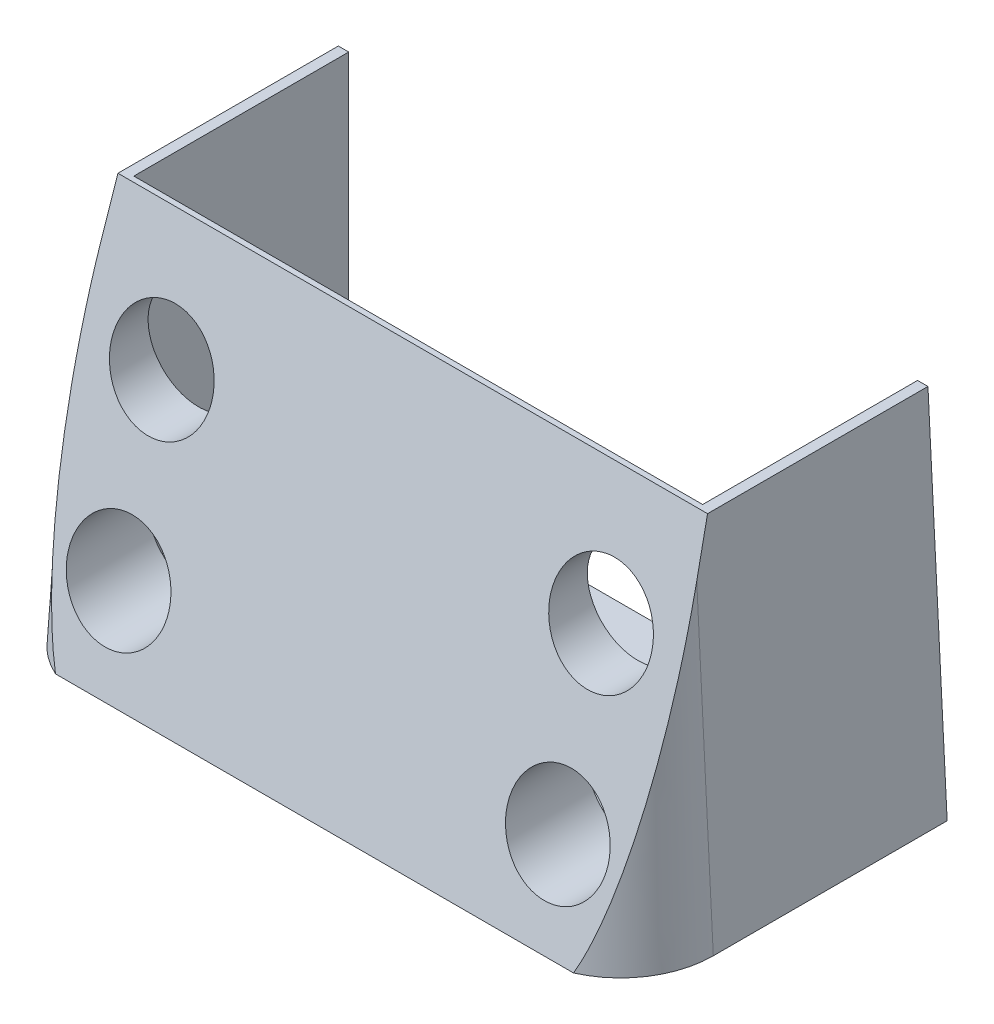
ISO-10303-21;
HEADER;
FILE_DESCRIPTION(('STEP AP214'),'2;1');
FILE_NAME('part.step','',(''),(''),'','','');
FILE_SCHEMA(('AUTOMOTIVE_DESIGN { 1 0 10303 214 1 1 1 1 }'));
ENDSEC;
DATA;
#1=APPLICATION_CONTEXT('core data for automotive mechanical design processes');
#2=APPLICATION_PROTOCOL_DEFINITION('international standard','automotive_design',2000,#1);
#3=PRODUCT_CONTEXT('',#1,'mechanical');
#4=PRODUCT('Part','Part','',(#3));
#5=PRODUCT_RELATED_PRODUCT_CATEGORY('part','',(#4));
#6=PRODUCT_DEFINITION_FORMATION('','',#4);
#7=PRODUCT_DEFINITION_CONTEXT('part definition',#1,'design');
#8=PRODUCT_DEFINITION('design','',#6,#7);
#9=PRODUCT_DEFINITION_SHAPE('','',#8);
#10=(LENGTH_UNIT() NAMED_UNIT(*) SI_UNIT(.MILLI.,.METRE.));
#11=(NAMED_UNIT(*) PLANE_ANGLE_UNIT() SI_UNIT($,.RADIAN.));
#12=(NAMED_UNIT(*) SI_UNIT($,.STERADIAN.) SOLID_ANGLE_UNIT());
#13=UNCERTAINTY_MEASURE_WITH_UNIT(LENGTH_MEASURE(1.E-05),#10,'distance_accuracy_value','');
#14=(GEOMETRIC_REPRESENTATION_CONTEXT(3) GLOBAL_UNCERTAINTY_ASSIGNED_CONTEXT((#13)) GLOBAL_UNIT_ASSIGNED_CONTEXT((#10,
#11,#12)) REPRESENTATION_CONTEXT('',''));
#15=CARTESIAN_POINT('',(0.,0.,0.));
#16=DIRECTION('',(0.,0.,1.));
#17=DIRECTION('',(1.,0.,0.));
#18=AXIS2_PLACEMENT_3D('',#15,#16,#17);
#19=CARTESIAN_POINT('',(30.738531217904,5.52547100644279,39.7908140059585));
#20=DIRECTION('',(0.,0.,-1.));
#21=DIRECTION('',(-1.,0.,0.));
#22=AXIS2_PLACEMENT_3D('',#19,#20,#21);
#23=CYLINDRICAL_SURFACE('',#22,8.);
#24=CARTESIAN_POINT('',(30.738531217904,5.52547100644279,27.618030839345));
#25=DIRECTION('',(0.,-0.258819045102516,-0.96592582628907));
#26=DIRECTION('',(0.,0.96592582628907,-0.258819045102516));
#27=AXIS2_PLACEMENT_3D('',#24,#25,#26);
#28=ELLIPSE('',#27,8.28220944328066,8.);
#29=CARTESIAN_POINT('',(30.738531217904,13.5254710064428,25.4744372998961));
#30=VERTEX_POINT('',#29);
#31=EDGE_CURVE('E242',#30,#30,#28,.F.);
#32=ORIENTED_EDGE('',*,*,#31,.T.);
#33=EDGE_LOOP('',(#32));
#34=FACE_BOUND('',#33,.T.);
#35=CARTESIAN_POINT('',(30.738531217904,5.52547100644279,21.7908140059585));
#36=DIRECTION('',(0.,0.,-1.));
#37=DIRECTION('',(-1.,0.,0.));
#38=AXIS2_PLACEMENT_3D('',#35,#36,#37);
#39=CIRCLE('',#38,8.);
#40=CARTESIAN_POINT('',(22.738531217904,5.52547100644279,21.7908140059585));
#41=VERTEX_POINT('',#40);
#42=EDGE_CURVE('E237',#41,#41,#39,.T.);
#43=ORIENTED_EDGE('',*,*,#42,.T.);
#44=EDGE_LOOP('',(#43));
#45=FACE_BOUND('',#44,.T.);
#46=ADVANCED_FACE('F41',(#34,#45),#23,.F.);
#47=CARTESIAN_POINT('',(-38.761468782096,-19.9745289935572,39.7908140059585));
#48=DIRECTION('',(0.,0.,-1.));
#49=DIRECTION('',(-1.,0.,0.));
#50=AXIS2_PLACEMENT_3D('',#47,#48,#49);
#51=CYLINDRICAL_SURFACE('',#50,8.);
#52=CARTESIAN_POINT('',(-38.761468782096,-19.9745289935572,34.4507352463385));
#53=DIRECTION('',(0.,-0.258819045102516,-0.96592582628907));
#54=DIRECTION('',(0.,0.96592582628907,-0.258819045102516));
#55=AXIS2_PLACEMENT_3D('',#52,#53,#54);
#56=ELLIPSE('',#55,8.28220944328065,8.);
#57=CARTESIAN_POINT('',(-38.761468782096,-11.9745289935572,32.3071417068896));
#58=VERTEX_POINT('',#57);
#59=EDGE_CURVE('E288',#58,#58,#56,.F.);
#60=ORIENTED_EDGE('',*,*,#59,.T.);
#61=EDGE_LOOP('',(#60));
#62=FACE_BOUND('',#61,.T.);
#63=CARTESIAN_POINT('',(-38.761468782096,-19.9745289935572,21.7908140059585));
#64=DIRECTION('',(0.,0.,-1.));
#65=DIRECTION('',(-1.,0.,0.));
#66=AXIS2_PLACEMENT_3D('',#63,#64,#65);
#67=CIRCLE('',#66,8.);
#68=CARTESIAN_POINT('',(-46.761468782096,-19.9745289935572,21.7908140059585));
#69=VERTEX_POINT('',#68);
#70=EDGE_CURVE('E225',#69,#69,#67,.T.);
#71=ORIENTED_EDGE('',*,*,#70,.T.);
#72=EDGE_LOOP('',(#71));
#73=FACE_BOUND('',#72,.T.);
#74=ADVANCED_FACE('F312',(#62,#73),#51,.F.);
#75=CARTESIAN_POINT('',(30.738531217904,-19.9745289935572,39.7908140059585));
#76=DIRECTION('',(0.,0.,-1.));
#77=DIRECTION('',(-1.,0.,0.));
#78=AXIS2_PLACEMENT_3D('',#75,#76,#77);
#79=CYLINDRICAL_SURFACE('',#78,8.);
#80=CARTESIAN_POINT('',(30.738531217904,-19.9745289935572,34.4507352463385));
#81=DIRECTION('',(0.,-0.258819045102516,-0.96592582628907));
#82=DIRECTION('',(0.,0.96592582628907,-0.258819045102516));
#83=AXIS2_PLACEMENT_3D('',#80,#81,#82);
#84=ELLIPSE('',#83,8.28220944328066,8.);
#85=CARTESIAN_POINT('',(30.738531217904,-11.9745289935572,32.3071417068896));
#86=VERTEX_POINT('',#85);
#87=EDGE_CURVE('E290',#86,#86,#84,.F.);
#88=ORIENTED_EDGE('',*,*,#87,.T.);
#89=EDGE_LOOP('',(#88));
#90=FACE_BOUND('',#89,.T.);
#91=CARTESIAN_POINT('',(30.738531217904,-19.9745289935572,21.7908140059585));
#92=DIRECTION('',(0.,0.,-1.));
#93=DIRECTION('',(-1.,0.,0.));
#94=AXIS2_PLACEMENT_3D('',#91,#92,#93);
#95=CIRCLE('',#94,8.);
#96=CARTESIAN_POINT('',(22.738531217904,-19.9745289935572,21.7908140059585));
#97=VERTEX_POINT('',#96);
#98=EDGE_CURVE('E229',#97,#97,#95,.T.);
#99=ORIENTED_EDGE('',*,*,#98,.T.);
#100=EDGE_LOOP('',(#99));
#101=FACE_BOUND('',#100,.T.);
#102=ADVANCED_FACE('F564',(#90,#101),#79,.F.);
#103=CARTESIAN_POINT('',(-38.761468782096,5.52547100644279,39.7908140059585));
#104=DIRECTION('',(0.,0.,-1.));
#105=DIRECTION('',(-1.,0.,0.));
#106=AXIS2_PLACEMENT_3D('',#103,#104,#105);
#107=CYLINDRICAL_SURFACE('',#106,8.);
#108=CARTESIAN_POINT('',(-38.761468782096,5.52547100644279,27.618030839345));
#109=DIRECTION('',(0.,-0.258819045102516,-0.96592582628907));
#110=DIRECTION('',(0.,0.96592582628907,-0.258819045102516));
#111=AXIS2_PLACEMENT_3D('',#108,#109,#110);
#112=ELLIPSE('',#111,8.28220944328065,8.);
#113=CARTESIAN_POINT('',(-38.761468782096,13.5254710064428,25.4744372998961));
#114=VERTEX_POINT('',#113);
#115=EDGE_CURVE('E46',#114,#114,#112,.F.);
#116=ORIENTED_EDGE('',*,*,#115,.T.);
#117=EDGE_LOOP('',(#116));
#118=FACE_BOUND('',#117,.T.);
#119=CARTESIAN_POINT('',(-38.761468782096,5.52547100644279,21.7908140059585));
#120=DIRECTION('',(0.,0.,-1.));
#121=DIRECTION('',(-1.,0.,0.));
#122=AXIS2_PLACEMENT_3D('',#119,#120,#121);
#123=CIRCLE('',#122,8.);
#124=CARTESIAN_POINT('',(-46.761468782096,5.52547100644279,21.7908140059585));
#125=VERTEX_POINT('',#124);
#126=EDGE_CURVE('E234',#125,#125,#123,.T.);
#127=ORIENTED_EDGE('',*,*,#126,.T.);
#128=EDGE_LOOP('',(#127));
#129=FACE_BOUND('',#128,.T.);
#130=ADVANCED_FACE('F297',(#118,#129),#107,.F.);
#131=CARTESIAN_POINT('',(-39.011468782096,-29.9745289935572,-45.2091859940415));
#132=DIRECTION('',(0.,-1.,0.));
#133=DIRECTION('',(0.,0.,-1.));
#134=AXIS2_PLACEMENT_3D('',#131,#132,#133);
#135=PLANE('',#134);
#136=DIRECTION('',(0.,0.,-1.));
#137=VECTOR('',#136,1.);
#138=CARTESIAN_POINT('',(37.6740845422055,-29.9745289935572,30.2020239403742));
#139=LINE('',#138,#137);
#140=CARTESIAN_POINT('',(37.6740845422055,-29.9745289935572,30.2020239403742));
#141=VERTEX_POINT('',#140);
#142=CARTESIAN_POINT('',(37.6740845422055,-29.9745289935572,21.7908140059585));
#143=VERTEX_POINT('',#142);
#144=EDGE_CURVE('E369',#141,#143,#139,.T.);
#145=ORIENTED_EDGE('',*,*,#144,.F.);
#146=DIRECTION('',(1.,0.,0.));
#147=VECTOR('',#146,1.);
#148=CARTESIAN_POINT('',(37.6740845422055,-29.9745289935572,30.2020239403742));
#149=LINE('',#148,#147);
#150=CARTESIAN_POINT('',(29.6740845422055,-29.9745289935572,30.2020239403742));
#151=VERTEX_POINT('',#150);
#152=EDGE_CURVE('E520',#151,#141,#149,.T.);
#153=ORIENTED_EDGE('',*,*,#152,.F.);
#154=DIRECTION('',(0.,0.,1.));
#155=VECTOR('',#154,1.);
#156=CARTESIAN_POINT('',(29.6740845422055,-29.9745289935572,30.2020239403742));
#157=LINE('',#156,#155);
#158=CARTESIAN_POINT('',(29.6740845422055,-29.9745289935572,21.7908140059585));
#159=VERTEX_POINT('',#158);
#160=EDGE_CURVE('E467',#159,#151,#157,.T.);
#161=ORIENTED_EDGE('',*,*,#160,.F.);
#162=DIRECTION('',(-1.,0.,0.));
#163=VECTOR('',#162,1.);
#164=CARTESIAN_POINT('',(-44.011468782096,-29.9745289935572,21.7908140059585));
#165=LINE('',#164,#163);
#166=EDGE_CURVE('E357',#143,#159,#165,.T.);
#167=ORIENTED_EDGE('',*,*,#166,.F.);
#168=EDGE_LOOP('',(#145,#153,#161,#167));
#169=FACE_BOUND('',#168,.T.);
#170=ADVANCED_FACE('F541',(#169),#135,.T.);
#171=CARTESIAN_POINT('',(-39.011468782096,-29.9745289935572,-45.2091859940415));
#172=DIRECTION('',(0.,-1.,0.));
#173=DIRECTION('',(0.,0.,-1.));
#174=AXIS2_PLACEMENT_3D('',#171,#172,#173);
#175=PLANE('',#174);
#176=DIRECTION('',(0.,0.,-1.));
#177=VECTOR('',#176,1.);
#178=CARTESIAN_POINT('',(-37.6970221063976,-29.9745289935572,30.2020239403742));
#179=LINE('',#178,#177);
#180=CARTESIAN_POINT('',(-37.6970221063976,-29.9745289935572,30.2020239403742));
#181=VERTEX_POINT('',#180);
#182=CARTESIAN_POINT('',(-37.6970221063976,-29.9745289935572,21.7908140059585));
#183=VERTEX_POINT('',#182);
#184=EDGE_CURVE('E502',#181,#183,#179,.T.);
#185=ORIENTED_EDGE('',*,*,#184,.F.);
#186=DIRECTION('',(1.,0.,0.));
#187=VECTOR('',#186,1.);
#188=CARTESIAN_POINT('',(-45.6970221063976,-29.9745289935572,30.2020239403742));
#189=LINE('',#188,#187);
#190=CARTESIAN_POINT('',(-45.6970221063976,-29.9745289935572,30.2020239403742));
#191=VERTEX_POINT('',#190);
#192=EDGE_CURVE('E505',#191,#181,#189,.T.);
#193=ORIENTED_EDGE('',*,*,#192,.F.);
#194=DIRECTION('',(0.,0.,1.));
#195=VECTOR('',#194,1.);
#196=CARTESIAN_POINT('',(-45.6970221063976,-29.9745289935572,30.2020239403742));
#197=LINE('',#196,#195);
#198=CARTESIAN_POINT('',(-45.6970221063976,-29.9745289935572,21.7908140059585));
#199=VERTEX_POINT('',#198);
#200=EDGE_CURVE('E366',#199,#191,#197,.T.);
#201=ORIENTED_EDGE('',*,*,#200,.F.);
#202=DIRECTION('',(-1.,0.,0.));
#203=VECTOR('',#202,1.);
#204=CARTESIAN_POINT('',(-44.011468782096,-29.9745289935572,21.7908140059585));
#205=LINE('',#204,#203);
#206=EDGE_CURVE('E356',#183,#199,#205,.T.);
#207=ORIENTED_EDGE('',*,*,#206,.F.);
#208=EDGE_LOOP('',(#185,#193,#201,#207));
#209=FACE_BOUND('',#208,.T.);
#210=ADVANCED_FACE('F594',(#209),#175,.T.);
#211=CARTESIAN_POINT('',(-39.011468782096,-29.9745289935572,-45.2091859940415));
#212=DIRECTION('',(0.,-1.,0.));
#213=DIRECTION('',(0.,0.,-1.));
#214=AXIS2_PLACEMENT_3D('',#211,#212,#213);
#215=PLANE('',#214);
#216=DIRECTION('',(1.,0.,0.));
#217=VECTOR('',#216,1.);
#218=CARTESIAN_POINT('',(-49.011468782096,-29.9745289935572,14.7908140059585));
#219=LINE('',#218,#217);
#220=CARTESIAN_POINT('',(-37.6970221063976,-29.9745289935572,14.7908140059585));
#221=VERTEX_POINT('',#220);
#222=CARTESIAN_POINT('',(29.6740845422055,-29.9745289935572,14.7908140059585));
#223=VERTEX_POINT('',#222);
#224=EDGE_CURVE('E393',#221,#223,#219,.T.);
#225=ORIENTED_EDGE('',*,*,#224,.F.);
#226=EDGE_CURVE('E353',#183,#221,#179,.T.);
#227=ORIENTED_EDGE('',*,*,#226,.F.);
#228=DIRECTION('',(1.,0.,0.));
#229=VECTOR('',#228,1.);
#230=CARTESIAN_POINT('',(-44.011468782096,-29.9745289935572,21.7908140059585));
#231=LINE('',#230,#229);
#232=EDGE_CURVE('E268',#183,#159,#231,.T.);
#233=ORIENTED_EDGE('',*,*,#232,.T.);
#234=EDGE_CURVE('E350',#223,#159,#157,.T.);
#235=ORIENTED_EDGE('',*,*,#234,.F.);
#236=EDGE_LOOP('',(#225,#227,#233,#235));
#237=FACE_BOUND('',#236,.T.);
#238=ADVANCED_FACE('F348',(#237),#215,.F.);
#239=CARTESIAN_POINT('',(-49.011468782096,-29.9745289935572,21.7908140059585));
#240=VERTEX_POINT('',#239);
#241=EDGE_CURVE('E265',#240,#199,#231,.T.);
#242=ORIENTED_EDGE('',*,*,#241,.T.);
#243=CARTESIAN_POINT('',(-45.6970221063976,-29.9745289935572,14.7908140059585));
#244=VERTEX_POINT('',#243);
#245=EDGE_CURVE('E361',#244,#199,#197,.T.);
#246=ORIENTED_EDGE('',*,*,#245,.F.);
#247=CARTESIAN_POINT('',(-49.011468782096,-29.9745289935572,14.7908140059585));
#248=VERTEX_POINT('',#247);
#249=EDGE_CURVE('E389',#248,#244,#219,.T.);
#250=ORIENTED_EDGE('',*,*,#249,.F.);
#251=DIRECTION('',(0.,0.,1.));
#252=VECTOR('',#251,1.);
#253=CARTESIAN_POINT('',(-49.011468782096,-29.9745289935572,26.7908140059585));
#254=LINE('',#253,#252);
#255=EDGE_CURVE('E257',#248,#240,#254,.T.);
#256=ORIENTED_EDGE('',*,*,#255,.T.);
#257=EDGE_LOOP('',(#242,#246,#250,#256));
#258=FACE_BOUND('',#257,.T.);
#259=ADVANCED_FACE('F449',(#258),#215,.F.);
#260=CARTESIAN_POINT('',(37.6740845422055,-29.9745289935572,14.7908140059585));
#261=VERTEX_POINT('',#260);
#262=CARTESIAN_POINT('',(40.988531217904,-29.9745289935572,14.7908140059585));
#263=VERTEX_POINT('',#262);
#264=EDGE_CURVE('E339',#261,#263,#219,.T.);
#265=ORIENTED_EDGE('',*,*,#264,.F.);
#266=EDGE_CURVE('E341',#143,#261,#139,.T.);
#267=ORIENTED_EDGE('',*,*,#266,.F.);
#268=CARTESIAN_POINT('',(40.988531217904,-29.9745289935572,21.7908140059585));
#269=VERTEX_POINT('',#268);
#270=EDGE_CURVE('E264',#143,#269,#231,.T.);
#271=ORIENTED_EDGE('',*,*,#270,.T.);
#272=DIRECTION('',(0.,0.,-1.));
#273=VECTOR('',#272,1.);
#274=CARTESIAN_POINT('',(40.988531217904,-29.9745289935572,26.7908140059585));
#275=LINE('',#274,#273);
#276=EDGE_CURVE('E261',#269,#263,#275,.T.);
#277=ORIENTED_EDGE('',*,*,#276,.T.);
#278=EDGE_LOOP('',(#265,#267,#271,#277));
#279=FACE_BOUND('',#278,.T.);
#280=ADVANCED_FACE('F337',(#279),#215,.F.);
#281=CARTESIAN_POINT('',(-53.6970221063976,-15.9745289935572,-70.2091859940415));
#282=DIRECTION('',(0.,-1.,0.));
#283=DIRECTION('',(0.,0.,-1.));
#284=AXIS2_PLACEMENT_3D('',#281,#282,#283);
#285=PLANE('',#284);
#286=DIRECTION('',(-1.,0.,0.));
#287=VECTOR('',#286,1.);
#288=CARTESIAN_POINT('',(-49.011468782096,-15.9745289935572,14.7908140059585));
#289=LINE('',#288,#287);
#290=CARTESIAN_POINT('',(40.988531217904,-15.9745289935572,14.7908140059585));
#291=VERTEX_POINT('',#290);
#292=CARTESIAN_POINT('',(-49.011468782096,-15.9745289935572,14.7908140059585));
#293=VERTEX_POINT('',#292);
#294=EDGE_CURVE('E395',#291,#293,#289,.T.);
#295=ORIENTED_EDGE('',*,*,#294,.F.);
#296=DIRECTION('',(0.,0.,1.));
#297=VECTOR('',#296,1.);
#298=CARTESIAN_POINT('',(40.988531217904,-15.9745289935572,14.7908140059585));
#299=LINE('',#298,#297);
#300=CARTESIAN_POINT('',(40.988531217904,-15.9745289935572,11.7908140059585));
#301=VERTEX_POINT('',#300);
#302=EDGE_CURVE('E376',#301,#291,#299,.T.);
#303=ORIENTED_EDGE('',*,*,#302,.F.);
#304=DIRECTION('',(1.,0.,0.));
#305=VECTOR('',#304,1.);
#306=CARTESIAN_POINT('',(-49.011468782096,-15.9745289935572,11.7908140059585));
#307=LINE('',#306,#305);
#308=CARTESIAN_POINT('',(-49.011468782096,-15.9745289935572,11.7908140059585));
#309=VERTEX_POINT('',#308);
#310=EDGE_CURVE('E372',#309,#301,#307,.T.);
#311=ORIENTED_EDGE('',*,*,#310,.F.);
#312=DIRECTION('',(0.,0.,-1.));
#313=VECTOR('',#312,1.);
#314=CARTESIAN_POINT('',(-49.011468782096,-15.9745289935572,14.7908140059585));
#315=LINE('',#314,#313);
#316=EDGE_CURVE('E363',#293,#309,#315,.T.);
#317=ORIENTED_EDGE('',*,*,#316,.F.);
#318=EDGE_LOOP('',(#295,#303,#311,#317));
#319=FACE_BOUND('',#318,.T.);
#320=ADVANCED_FACE('F480',(#319),#285,.F.);
#321=CARTESIAN_POINT('',(-49.011468782096,75.0323388791479,11.7908140059585));
#322=DIRECTION('',(0.,0.,1.));
#323=DIRECTION('',(1.,0.,0.));
#324=AXIS2_PLACEMENT_3D('',#321,#322,#323);
#325=PLANE('',#324);
#326=DIRECTION('',(0.,-1.,0.));
#327=VECTOR('',#326,1.);
#328=CARTESIAN_POINT('',(-49.011468782096,75.0323388791479,11.7908140059585));
#329=LINE('',#328,#327);
#330=CARTESIAN_POINT('',(-49.011468782096,-29.9745289935572,11.7908140059585));
#331=VERTEX_POINT('',#330);
#332=EDGE_CURVE('E383',#309,#331,#329,.T.);
#333=ORIENTED_EDGE('',*,*,#332,.F.);
#334=ORIENTED_EDGE('',*,*,#310,.T.);
#335=DIRECTION('',(0.,-1.,0.));
#336=VECTOR('',#335,1.);
#337=CARTESIAN_POINT('',(40.988531217904,75.0323388791479,11.7908140059585));
#338=LINE('',#337,#336);
#339=CARTESIAN_POINT('',(40.988531217904,-29.9745289935572,11.7908140059585));
#340=VERTEX_POINT('',#339);
#341=EDGE_CURVE('E380',#301,#340,#338,.T.);
#342=ORIENTED_EDGE('',*,*,#341,.T.);
#343=DIRECTION('',(-1.,0.,0.));
#344=VECTOR('',#343,1.);
#345=CARTESIAN_POINT('',(-49.011468782096,-29.9745289935572,11.7908140059585));
#346=LINE('',#345,#344);
#347=EDGE_CURVE('E386',#340,#331,#346,.T.);
#348=ORIENTED_EDGE('',*,*,#347,.T.);
#349=EDGE_LOOP('',(#333,#334,#342,#348));
#350=FACE_BOUND('',#349,.T.);
#351=ADVANCED_FACE('F319',(#350),#325,.F.);
#352=CARTESIAN_POINT('',(-44.011468782096,-14.9745289935572,21.7908140059585));
#353=DIRECTION('',(0.,0.,-1.));
#354=DIRECTION('',(-1.,0.,0.));
#355=AXIS2_PLACEMENT_3D('',#352,#353,#354);
#356=PLANE('',#355);
#357=ORIENTED_EDGE('',*,*,#126,.F.);
#358=EDGE_LOOP('',(#357));
#359=FACE_BOUND('',#358,.T.);
#360=ORIENTED_EDGE('',*,*,#98,.F.);
#361=EDGE_LOOP('',(#360));
#362=FACE_BOUND('',#361,.T.);
#363=ORIENTED_EDGE('',*,*,#70,.F.);
#364=EDGE_LOOP('',(#363));
#365=FACE_BOUND('',#364,.T.);
#366=ORIENTED_EDGE('',*,*,#42,.F.);
#367=EDGE_LOOP('',(#366));
#368=FACE_BOUND('',#367,.T.);
#369=DIRECTION('',(0.,-1.,0.));
#370=VECTOR('',#369,1.);
#371=CARTESIAN_POINT('',(40.988531217904,24.0254710064428,21.7908140059585));
#372=LINE('',#371,#370);
#373=CARTESIAN_POINT('',(40.988531217904,24.0254710064428,21.7908140059585));
#374=VERTEX_POINT('',#373);
#375=EDGE_CURVE('E254',#374,#269,#372,.T.);
#376=ORIENTED_EDGE('',*,*,#375,.T.);
#377=ORIENTED_EDGE('',*,*,#270,.F.);
#378=ORIENTED_EDGE('',*,*,#166,.T.);
#379=ORIENTED_EDGE('',*,*,#232,.F.);
#380=ORIENTED_EDGE('',*,*,#206,.T.);
#381=ORIENTED_EDGE('',*,*,#241,.F.);
#382=DIRECTION('',(0.,-1.,0.));
#383=VECTOR('',#382,1.);
#384=CARTESIAN_POINT('',(-49.011468782096,24.0254710064428,21.7908140059585));
#385=LINE('',#384,#383);
#386=CARTESIAN_POINT('',(-49.011468782096,24.0254710064428,21.7908140059585));
#387=VERTEX_POINT('',#386);
#388=EDGE_CURVE('E251',#387,#240,#385,.T.);
#389=ORIENTED_EDGE('',*,*,#388,.F.);
#390=DIRECTION('',(1.,0.,0.));
#391=VECTOR('',#390,1.);
#392=CARTESIAN_POINT('',(40.988531217904,24.0254710064428,21.7908140059585));
#393=LINE('',#392,#391);
#394=EDGE_CURVE('E243',#387,#374,#393,.T.);
#395=ORIENTED_EDGE('',*,*,#394,.T.);
#396=EDGE_LOOP('',(#376,#377,#378,#379,#380,#381,#389,#395));
#397=FACE_BOUND('',#396,.T.);
#398=ADVANCED_FACE('F316',(#359,#362,#365,#368,#397),#356,.T.);
#399=CARTESIAN_POINT('',(-39.011468782096,24.0254710064428,24.7908140059585));
#400=DIRECTION('',(0.,-1.,0.));
#401=DIRECTION('',(0.,0.,-1.));
#402=AXIS2_PLACEMENT_3D('',#399,#400,#401);
#403=CONICAL_SURFACE('',#402,11.6459021258853,0.0523598775598275);
#404=CARTESIAN_POINT('',(-39.011468782096,-33.9745289935572,24.7908140059585));
#405=DIRECTION('',(0.,1.,0.));
#406=DIRECTION('',(0.,0.,1.));
#407=AXIS2_PLACEMENT_3D('',#404,#405,#406);
#408=CIRCLE('',#407,14.6855533243015);
#409=CARTESIAN_POINT('',(-44.995190411311,-33.9745289935572,38.2020239403742));
#410=VERTEX_POINT('',#409);
#411=CARTESIAN_POINT('',(-53.6970221063976,-33.9745289935572,24.7908140059585));
#412=VERTEX_POINT('',#411);
#413=EDGE_CURVE('E224',#410,#412,#408,.F.);
#414=ORIENTED_EDGE('',*,*,#413,.F.);
#415=CARTESIAN_POINT('',(-39.011468782096,6.92159966935667,27.2439392915873));
#416=DIRECTION('',(0.,-0.258819045102516,-0.96592582628907));
#417=DIRECTION('',(0.,-0.965925826289069,0.258819045102516));
#418=AXIS2_PLACEMENT_3D('',#415,#416,#417);
#419=ELLIPSE('',#418,48.4596411165837,12.3000371853413);
#420=CARTESIAN_POINT('',(-51.0739437392477,16.0767878726555,24.7908140059585));
#421=VERTEX_POINT('',#420);
#422=EDGE_CURVE('E51',#410,#421,#419,.T.);
#423=ORIENTED_EDGE('',*,*,#422,.T.);
#424=DIRECTION('',(-0.0523359562429415,-0.998629534754574,0.));
#425=VECTOR('',#424,1.);
#426=CARTESIAN_POINT('',(-50.6573709079813,24.0254710064428,24.7908140059585));
#427=LINE('',#426,#425);
#428=EDGE_CURVE('E246',#421,#412,#427,.T.);
#429=ORIENTED_EDGE('',*,*,#428,.T.);
#430=EDGE_LOOP('',(#414,#423,#429));
#431=FACE_BOUND('',#430,.T.);
#432=ADVANCED_FACE('F303',(#431),#403,.T.);
#433=CARTESIAN_POINT('',(-39.011468782096,24.0254710064428,22.6609707793693));
#434=DIRECTION('',(0.,-0.258819045102516,-0.96592582628907));
#435=DIRECTION('',(1.,0.,0.));
#436=AXIS2_PLACEMENT_3D('',#433,#434,#435);
#437=PLANE('',#436);
#438=DIRECTION('',(1.,0.,0.));
#439=VECTOR('',#438,1.);
#440=CARTESIAN_POINT('',(-39.011468782096,-33.9745289935572,38.2020239403742));
#441=LINE('',#440,#439);
#442=CARTESIAN_POINT('',(36.9722528471189,-33.9745289935572,38.2020239403742));
#443=VERTEX_POINT('',#442);
#444=EDGE_CURVE('E392',#443,#410,#441,.F.);
#445=ORIENTED_EDGE('',*,*,#444,.F.);
#446=CARTESIAN_POINT('',(30.988531217904,6.92159966935676,27.2439392915873));
#447=DIRECTION('',(0.,-0.258819045102516,-0.96592582628907));
#448=DIRECTION('',(0.,-0.965925826289069,0.258819045102516));
#449=AXIS2_PLACEMENT_3D('',#446,#447,#448);
#450=ELLIPSE('',#449,48.4596411165838,12.3000371853413);
#451=CARTESIAN_POINT('',(43.0510061750556,16.0767878726556,24.7908140059585));
#452=VERTEX_POINT('',#451);
#453=EDGE_CURVE('E282',#452,#443,#450,.T.);
#454=ORIENTED_EDGE('',*,*,#453,.F.);
#455=DIRECTION('',(-0.0505572901604935,0.964690564113556,-0.258488057600147));
#456=VECTOR('',#455,1.);
#457=CARTESIAN_POINT('',(41.7474752045323,40.9496404978998,18.1261532315661));
#458=LINE('',#457,#456);
#459=CARTESIAN_POINT('',(42.6344333437893,24.0254710064428,22.6609707793694));
#460=VERTEX_POINT('',#459);
#461=EDGE_CURVE('E279',#460,#452,#458,.F.);
#462=ORIENTED_EDGE('',*,*,#461,.F.);
#463=DIRECTION('',(1.,0.,0.));
#464=VECTOR('',#463,1.);
#465=CARTESIAN_POINT('',(-39.011468782096,24.0254710064428,22.6609707793693));
#466=LINE('',#465,#464);
#467=CARTESIAN_POINT('',(-50.6573709079813,24.0254710064428,22.6609707793693));
#468=VERTEX_POINT('',#467);
#469=EDGE_CURVE('E273',#468,#460,#466,.T.);
#470=ORIENTED_EDGE('',*,*,#469,.F.);
#471=DIRECTION('',(-0.0505572901604934,-0.964690564113556,0.258488057600147));
#472=VECTOR('',#471,1.);
#473=CARTESIAN_POINT('',(-49.7704127687243,40.9496404978998,18.1261532315661));
#474=LINE('',#473,#472);
#475=EDGE_CURVE('E11',#421,#468,#474,.F.);
#476=ORIENTED_EDGE('',*,*,#475,.F.);
#477=ORIENTED_EDGE('',*,*,#422,.F.);
#478=EDGE_LOOP('',(#445,#454,#462,#470,#476,#477));
#479=FACE_BOUND('',#478,.T.);
#480=ORIENTED_EDGE('',*,*,#115,.F.);
#481=EDGE_LOOP('',(#480));
#482=FACE_BOUND('',#481,.T.);
#483=ORIENTED_EDGE('',*,*,#87,.F.);
#484=EDGE_LOOP('',(#483));
#485=FACE_BOUND('',#484,.T.);
#486=ORIENTED_EDGE('',*,*,#59,.F.);
#487=EDGE_LOOP('',(#486));
#488=FACE_BOUND('',#487,.T.);
#489=ORIENTED_EDGE('',*,*,#31,.F.);
#490=EDGE_LOOP('',(#489));
#491=FACE_BOUND('',#490,.T.);
#492=ADVANCED_FACE('F44',(#479,#482,#485,#488,#491),#437,.F.);
#493=CARTESIAN_POINT('',(30.988531217904,24.0254710064428,24.7908140059585));
#494=DIRECTION('',(0.,-1.,0.));
#495=DIRECTION('',(0.,0.,-1.));
#496=AXIS2_PLACEMENT_3D('',#493,#494,#495);
#497=CONICAL_SURFACE('',#496,11.6459021258853,0.0523598775598275);
#498=CARTESIAN_POINT('',(30.988531217904,-33.9745289935572,24.7908140059585));
#499=DIRECTION('',(0.,1.,0.));
#500=DIRECTION('',(0.,0.,1.));
#501=AXIS2_PLACEMENT_3D('',#498,#499,#500);
#502=CIRCLE('',#501,14.6855533243016);
#503=CARTESIAN_POINT('',(45.6740845422055,-33.9745289935572,24.7908140059585));
#504=VERTEX_POINT('',#503);
#505=EDGE_CURVE('E400',#504,#443,#502,.F.);
#506=ORIENTED_EDGE('',*,*,#505,.F.);
#507=DIRECTION('',(-0.0523359562429415,0.998629534754574,0.));
#508=VECTOR('',#507,1.);
#509=CARTESIAN_POINT('',(45.988531217904,-39.9745289935614,24.7908140059585));
#510=LINE('',#509,#508);
#511=EDGE_CURVE('E274',#504,#452,#510,.T.);
#512=ORIENTED_EDGE('',*,*,#511,.T.);
#513=ORIENTED_EDGE('',*,*,#453,.T.);
#514=EDGE_LOOP('',(#506,#512,#513));
#515=FACE_BOUND('',#514,.T.);
#516=ADVANCED_FACE('F302',(#515),#497,.T.);
#517=CARTESIAN_POINT('',(37.6740845422055,-12.6106183844049,30.2020239403742));
#518=DIRECTION('',(1.,0.,0.));
#519=DIRECTION('',(0.,1.,0.));
#520=AXIS2_PLACEMENT_3D('',#517,#518,#519);
#521=PLANE('',#520);
#522=ORIENTED_EDGE('',*,*,#144,.T.);
#523=ORIENTED_EDGE('',*,*,#266,.T.);
#524=DIRECTION('',(0.,-1.,0.));
#525=VECTOR('',#524,1.);
#526=CARTESIAN_POINT('',(37.6740845422055,-12.6106183844049,14.7908140059585));
#527=LINE('',#526,#525);
#528=CARTESIAN_POINT('',(37.6740845422055,-33.9745289935572,14.7908140059585));
#529=VERTEX_POINT('',#528);
#530=EDGE_CURVE('E485',#261,#529,#527,.T.);
#531=ORIENTED_EDGE('',*,*,#530,.T.);
#532=DIRECTION('',(0.,0.,1.));
#533=VECTOR('',#532,1.);
#534=CARTESIAN_POINT('',(37.6740845422055,-33.9745289935572,30.2020239403742));
#535=LINE('',#534,#533);
#536=CARTESIAN_POINT('',(37.6740845422055,-33.9745289935572,30.2020239403742));
#537=VERTEX_POINT('',#536);
#538=EDGE_CURVE('E524',#529,#537,#535,.T.);
#539=ORIENTED_EDGE('',*,*,#538,.T.);
#540=DIRECTION('',(0.,-1.,0.));
#541=VECTOR('',#540,1.);
#542=CARTESIAN_POINT('',(37.6740845422055,-12.6106183844049,30.2020239403742));
#543=LINE('',#542,#541);
#544=EDGE_CURVE('E527',#141,#537,#543,.T.);
#545=ORIENTED_EDGE('',*,*,#544,.F.);
#546=EDGE_LOOP('',(#522,#523,#531,#539,#545));
#547=FACE_BOUND('',#546,.T.);
#548=ADVANCED_FACE('F540',(#547),#521,.F.);
#549=CARTESIAN_POINT('',(37.6740845422055,-12.6106183844049,30.2020239403742));
#550=DIRECTION('',(0.,0.,1.));
#551=DIRECTION('',(1.,0.,0.));
#552=AXIS2_PLACEMENT_3D('',#549,#550,#551);
#553=PLANE('',#552);
#554=ORIENTED_EDGE('',*,*,#152,.T.);
#555=ORIENTED_EDGE('',*,*,#544,.T.);
#556=DIRECTION('',(-1.,0.,0.));
#557=VECTOR('',#556,1.);
#558=CARTESIAN_POINT('',(37.6740845422055,-33.9745289935572,30.2020239403742));
#559=LINE('',#558,#557);
#560=CARTESIAN_POINT('',(29.6740845422055,-33.9745289935572,30.2020239403742));
#561=VERTEX_POINT('',#560);
#562=EDGE_CURVE('E510',#537,#561,#559,.T.);
#563=ORIENTED_EDGE('',*,*,#562,.T.);
#564=DIRECTION('',(0.,-1.,0.));
#565=VECTOR('',#564,1.);
#566=CARTESIAN_POINT('',(29.6740845422055,-12.6106183844049,30.2020239403742));
#567=LINE('',#566,#565);
#568=EDGE_CURVE('E521',#151,#561,#567,.T.);
#569=ORIENTED_EDGE('',*,*,#568,.F.);
#570=EDGE_LOOP('',(#554,#555,#563,#569));
#571=FACE_BOUND('',#570,.T.);
#572=ADVANCED_FACE('F542',(#571),#553,.F.);
#573=CARTESIAN_POINT('',(29.6740845422055,-12.6106183844049,30.2020239403742));
#574=DIRECTION('',(-1.,0.,0.));
#575=DIRECTION('',(0.,0.,1.));
#576=AXIS2_PLACEMENT_3D('',#573,#574,#575);
#577=PLANE('',#576);
#578=ORIENTED_EDGE('',*,*,#234,.T.);
#579=ORIENTED_EDGE('',*,*,#160,.T.);
#580=ORIENTED_EDGE('',*,*,#568,.T.);
#581=DIRECTION('',(0.,0.,-1.));
#582=VECTOR('',#581,1.);
#583=CARTESIAN_POINT('',(29.6740845422055,-33.9745289935572,30.2020239403742));
#584=LINE('',#583,#582);
#585=CARTESIAN_POINT('',(29.6740845422055,-33.9745289935572,14.7908140059585));
#586=VERTEX_POINT('',#585);
#587=EDGE_CURVE('E533',#561,#586,#584,.T.);
#588=ORIENTED_EDGE('',*,*,#587,.T.);
#589=DIRECTION('',(0.,-1.,0.));
#590=VECTOR('',#589,1.);
#591=CARTESIAN_POINT('',(29.6740845422055,-12.6106183844049,14.7908140059585));
#592=LINE('',#591,#590);
#593=EDGE_CURVE('E486',#223,#586,#592,.T.);
#594=ORIENTED_EDGE('',*,*,#593,.F.);
#595=EDGE_LOOP('',(#578,#579,#580,#588,#594));
#596=FACE_BOUND('',#595,.T.);
#597=ADVANCED_FACE('F546',(#596),#577,.F.);
#598=CARTESIAN_POINT('',(-37.6970221063976,-12.6106183844049,30.2020239403742));
#599=DIRECTION('',(1.,0.,0.));
#600=DIRECTION('',(0.,0.,-1.));
#601=AXIS2_PLACEMENT_3D('',#598,#599,#600);
#602=PLANE('',#601);
#603=ORIENTED_EDGE('',*,*,#184,.T.);
#604=ORIENTED_EDGE('',*,*,#226,.T.);
#605=DIRECTION('',(0.,-1.,0.));
#606=VECTOR('',#605,1.);
#607=CARTESIAN_POINT('',(-37.6970221063976,-12.6106183844049,14.7908140059585));
#608=LINE('',#607,#606);
#609=CARTESIAN_POINT('',(-37.6970221063976,-33.9745289935572,14.7908140059585));
#610=VERTEX_POINT('',#609);
#611=EDGE_CURVE('E489',#221,#610,#608,.T.);
#612=ORIENTED_EDGE('',*,*,#611,.T.);
#613=DIRECTION('',(0.,0.,1.));
#614=VECTOR('',#613,1.);
#615=CARTESIAN_POINT('',(-37.6970221063976,-33.9745289935572,30.2020239403742));
#616=LINE('',#615,#614);
#617=CARTESIAN_POINT('',(-37.6970221063976,-33.9745289935572,30.2020239403742));
#618=VERTEX_POINT('',#617);
#619=EDGE_CURVE('E512',#610,#618,#616,.T.);
#620=ORIENTED_EDGE('',*,*,#619,.T.);
#621=DIRECTION('',(0.,-1.,0.));
#622=VECTOR('',#621,1.);
#623=CARTESIAN_POINT('',(-37.6970221063976,-12.6106183844049,30.2020239403742));
#624=LINE('',#623,#622);
#625=EDGE_CURVE('E495',#181,#618,#624,.T.);
#626=ORIENTED_EDGE('',*,*,#625,.F.);
#627=EDGE_LOOP('',(#603,#604,#612,#620,#626));
#628=FACE_BOUND('',#627,.T.);
#629=ADVANCED_FACE('F499',(#628),#602,.F.);
#630=CARTESIAN_POINT('',(-45.6970221063976,-12.6106183844049,30.2020239403742));
#631=DIRECTION('',(0.,0.,1.));
#632=DIRECTION('',(1.,0.,0.));
#633=AXIS2_PLACEMENT_3D('',#630,#631,#632);
#634=PLANE('',#633);
#635=ORIENTED_EDGE('',*,*,#192,.T.);
#636=ORIENTED_EDGE('',*,*,#625,.T.);
#637=DIRECTION('',(-1.,0.,0.));
#638=VECTOR('',#637,1.);
#639=CARTESIAN_POINT('',(-45.6970221063976,-33.9745289935572,30.2020239403742));
#640=LINE('',#639,#638);
#641=CARTESIAN_POINT('',(-45.6970221063976,-33.9745289935572,30.2020239403742));
#642=VERTEX_POINT('',#641);
#643=EDGE_CURVE('E514',#618,#642,#640,.T.);
#644=ORIENTED_EDGE('',*,*,#643,.T.);
#645=DIRECTION('',(0.,-1.,0.));
#646=VECTOR('',#645,1.);
#647=CARTESIAN_POINT('',(-45.6970221063976,-12.6106183844049,30.2020239403742));
#648=LINE('',#647,#646);
#649=EDGE_CURVE('E503',#191,#642,#648,.T.);
#650=ORIENTED_EDGE('',*,*,#649,.F.);
#651=EDGE_LOOP('',(#635,#636,#644,#650));
#652=FACE_BOUND('',#651,.T.);
#653=ADVANCED_FACE('F783',(#652),#634,.F.);
#654=CARTESIAN_POINT('',(-45.6970221063976,-12.6106183844049,30.2020239403742));
#655=DIRECTION('',(-1.,0.,0.));
#656=DIRECTION('',(0.,-1.,0.));
#657=AXIS2_PLACEMENT_3D('',#654,#655,#656);
#658=PLANE('',#657);
#659=ORIENTED_EDGE('',*,*,#245,.T.);
#660=ORIENTED_EDGE('',*,*,#200,.T.);
#661=ORIENTED_EDGE('',*,*,#649,.T.);
#662=DIRECTION('',(0.,0.,-1.));
#663=VECTOR('',#662,1.);
#664=CARTESIAN_POINT('',(-45.6970221063976,-33.9745289935572,30.2020239403742));
#665=LINE('',#664,#663);
#666=CARTESIAN_POINT('',(-45.6970221063976,-33.9745289935572,14.7908140059585));
#667=VERTEX_POINT('',#666);
#668=EDGE_CURVE('E67',#642,#667,#665,.T.);
#669=ORIENTED_EDGE('',*,*,#668,.T.);
#670=DIRECTION('',(0.,-1.,0.));
#671=VECTOR('',#670,1.);
#672=CARTESIAN_POINT('',(-45.6970221063976,-12.6106183844049,14.7908140059585));
#673=LINE('',#672,#671);
#674=EDGE_CURVE('E496',#244,#667,#673,.T.);
#675=ORIENTED_EDGE('',*,*,#674,.F.);
#676=EDGE_LOOP('',(#659,#660,#661,#669,#675));
#677=FACE_BOUND('',#676,.T.);
#678=ADVANCED_FACE('F557',(#677),#658,.F.);
#679=CARTESIAN_POINT('',(-49.011468782096,75.0323388791479,14.7908140059585));
#680=DIRECTION('',(0.,0.,-1.));
#681=DIRECTION('',(-1.,0.,0.));
#682=AXIS2_PLACEMENT_3D('',#679,#680,#681);
#683=PLANE('',#682);
#684=DIRECTION('',(0.,-1.,0.));
#685=VECTOR('',#684,1.);
#686=CARTESIAN_POINT('',(40.988531217904,75.0323388791479,14.7908140059585));
#687=LINE('',#686,#685);
#688=EDGE_CURVE('E334',#291,#263,#687,.T.);
#689=ORIENTED_EDGE('',*,*,#688,.F.);
#690=ORIENTED_EDGE('',*,*,#294,.T.);
#691=DIRECTION('',(0.,-1.,0.));
#692=VECTOR('',#691,1.);
#693=CARTESIAN_POINT('',(-49.011468782096,75.0323388791479,14.7908140059585));
#694=LINE('',#693,#692);
#695=EDGE_CURVE('E375',#293,#248,#694,.T.);
#696=ORIENTED_EDGE('',*,*,#695,.T.);
#697=ORIENTED_EDGE('',*,*,#249,.T.);
#698=ORIENTED_EDGE('',*,*,#674,.T.);
#699=DIRECTION('',(1.,0.,0.));
#700=VECTOR('',#699,1.);
#701=CARTESIAN_POINT('',(-45.6970221063976,-33.9745289935572,14.7908140059585));
#702=LINE('',#701,#700);
#703=EDGE_CURVE('E491',#667,#610,#702,.T.);
#704=ORIENTED_EDGE('',*,*,#703,.T.);
#705=ORIENTED_EDGE('',*,*,#611,.F.);
#706=ORIENTED_EDGE('',*,*,#224,.T.);
#707=ORIENTED_EDGE('',*,*,#593,.T.);
#708=DIRECTION('',(1.,0.,0.));
#709=VECTOR('',#708,1.);
#710=CARTESIAN_POINT('',(37.6740845422055,-33.9745289935572,14.7908140059585));
#711=LINE('',#710,#709);
#712=EDGE_CURVE('E531',#586,#529,#711,.T.);
#713=ORIENTED_EDGE('',*,*,#712,.T.);
#714=ORIENTED_EDGE('',*,*,#530,.F.);
#715=ORIENTED_EDGE('',*,*,#264,.T.);
#716=EDGE_LOOP('',(#689,#690,#696,#697,#698,#704,#705,#706,#707,#713,#714,#715));
#717=FACE_BOUND('',#716,.T.);
#718=ADVANCED_FACE('F483',(#717),#683,.F.);
#719=CARTESIAN_POINT('',(-54.011468782096,-33.9745289935572,-50.2091859940415));
#720=DIRECTION('',(0.,1.,0.));
#721=DIRECTION('',(0.,0.,1.));
#722=AXIS2_PLACEMENT_3D('',#719,#720,#721);
#723=PLANE('',#722);
#724=ORIENTED_EDGE('',*,*,#703,.F.);
#725=ORIENTED_EDGE('',*,*,#668,.F.);
#726=ORIENTED_EDGE('',*,*,#643,.F.);
#727=ORIENTED_EDGE('',*,*,#619,.F.);
#728=EDGE_LOOP('',(#724,#725,#726,#727));
#729=FACE_BOUND('',#728,.T.);
#730=ORIENTED_EDGE('',*,*,#587,.F.);
#731=ORIENTED_EDGE('',*,*,#562,.F.);
#732=ORIENTED_EDGE('',*,*,#538,.F.);
#733=ORIENTED_EDGE('',*,*,#712,.F.);
#734=EDGE_LOOP('',(#730,#731,#732,#733));
#735=FACE_BOUND('',#734,.T.);
#736=DIRECTION('',(0.,0.,-1.));
#737=VECTOR('',#736,1.);
#738=CARTESIAN_POINT('',(-53.6970221063976,-33.9745289935572,-45.2091859940415));
#739=LINE('',#738,#737);
#740=CARTESIAN_POINT('',(-53.6970221063976,-33.9745289935572,-12.2091859940415));
#741=VERTEX_POINT('',#740);
#742=EDGE_CURVE('E217',#412,#741,#739,.T.);
#743=ORIENTED_EDGE('',*,*,#742,.T.);
#744=DIRECTION('',(1.,0.,0.));
#745=VECTOR('',#744,1.);
#746=CARTESIAN_POINT('',(-53.6970221063976,-33.9745289935572,-12.2091859940415));
#747=LINE('',#746,#745);
#748=CARTESIAN_POINT('',(45.6740845422055,-33.9745289935572,-12.2091859940415));
#749=VERTEX_POINT('',#748);
#750=EDGE_CURVE('E202',#741,#749,#747,.T.);
#751=ORIENTED_EDGE('',*,*,#750,.T.);
#752=DIRECTION('',(0.,0.,1.));
#753=VECTOR('',#752,1.);
#754=CARTESIAN_POINT('',(45.6740845422055,-33.9745289935572,-45.2091859940415));
#755=LINE('',#754,#753);
#756=EDGE_CURVE('E226',#749,#504,#755,.T.);
#757=ORIENTED_EDGE('',*,*,#756,.T.);
#758=ORIENTED_EDGE('',*,*,#505,.T.);
#759=ORIENTED_EDGE('',*,*,#444,.T.);
#760=ORIENTED_EDGE('',*,*,#413,.T.);
#761=EDGE_LOOP('',(#743,#751,#757,#758,#759,#760));
#762=FACE_BOUND('',#761,.T.);
#763=ADVANCED_FACE('F222',(#729,#735,#762),#723,.F.);
#764=CARTESIAN_POINT('',(42.6344333437893,24.0254710064428,-45.2091859940415));
#765=DIRECTION('',(0.998629534754574,0.0523359562429415,0.));
#766=DIRECTION('',(0.,0.,1.));
#767=AXIS2_PLACEMENT_3D('',#764,#765,#766);
#768=PLANE('',#767);
#769=DIRECTION('',(0.0523359562429415,-0.998629534754574,0.));
#770=VECTOR('',#769,1.);
#771=CARTESIAN_POINT('',(42.6344333437893,24.0254710064428,-12.2091859940415));
#772=LINE('',#771,#770);
#773=CARTESIAN_POINT('',(42.6344333437893,24.0254710064428,-12.2091859940415));
#774=VERTEX_POINT('',#773);
#775=EDGE_CURVE('E59',#774,#749,#772,.T.);
#776=ORIENTED_EDGE('',*,*,#775,.F.);
#777=DIRECTION('',(0.,0.,-1.));
#778=VECTOR('',#777,1.);
#779=CARTESIAN_POINT('',(42.6344333437893,24.0254710064428,-45.2091859940415));
#780=LINE('',#779,#778);
#781=EDGE_CURVE('E270',#460,#774,#780,.T.);
#782=ORIENTED_EDGE('',*,*,#781,.F.);
#783=ORIENTED_EDGE('',*,*,#461,.T.);
#784=ORIENTED_EDGE('',*,*,#511,.F.);
#785=ORIENTED_EDGE('',*,*,#756,.F.);
#786=EDGE_LOOP('',(#776,#782,#783,#784,#785));
#787=FACE_BOUND('',#786,.T.);
#788=ADVANCED_FACE('F410',(#787),#768,.T.);
#789=CARTESIAN_POINT('',(-50.6573709079813,24.0254710064428,-45.2091859940415));
#790=DIRECTION('',(-0.998629534754574,0.0523359562429415,0.));
#791=DIRECTION('',(0.,0.,-1.));
#792=AXIS2_PLACEMENT_3D('',#789,#790,#791);
#793=PLANE('',#792);
#794=DIRECTION('',(0.0523359562429415,0.998629534754574,0.));
#795=VECTOR('',#794,1.);
#796=CARTESIAN_POINT('',(-50.6573709079813,24.0254710064428,-12.2091859940415));
#797=LINE('',#796,#795);
#798=CARTESIAN_POINT('',(-50.6573709079813,24.0254710064428,-12.2091859940415));
#799=VERTEX_POINT('',#798);
#800=EDGE_CURVE('E205',#741,#799,#797,.T.);
#801=ORIENTED_EDGE('',*,*,#800,.F.);
#802=ORIENTED_EDGE('',*,*,#742,.F.);
#803=ORIENTED_EDGE('',*,*,#428,.F.);
#804=ORIENTED_EDGE('',*,*,#475,.T.);
#805=DIRECTION('',(0.,0.,1.));
#806=VECTOR('',#805,1.);
#807=CARTESIAN_POINT('',(-50.6573709079813,24.0254710064428,24.7908140059585));
#808=LINE('',#807,#806);
#809=EDGE_CURVE('E219',#799,#468,#808,.T.);
#810=ORIENTED_EDGE('',*,*,#809,.F.);
#811=EDGE_LOOP('',(#801,#802,#803,#804,#810));
#812=FACE_BOUND('',#811,.T.);
#813=ADVANCED_FACE('F215',(#812),#793,.T.);
#814=CARTESIAN_POINT('',(-39.011468782096,24.0254710064428,-45.2091859940415));
#815=DIRECTION('',(0.,1.,0.));
#816=DIRECTION('',(0.,0.,1.));
#817=AXIS2_PLACEMENT_3D('',#814,#815,#816);
#818=PLANE('',#817);
#819=DIRECTION('',(1.,0.,0.));
#820=VECTOR('',#819,1.);
#821=CARTESIAN_POINT('',(-53.6970221063976,24.0254710064428,-12.2091859940415));
#822=LINE('',#821,#820);
#823=CARTESIAN_POINT('',(-49.011468782096,24.0254710064428,-12.2091859940415));
#824=VERTEX_POINT('',#823);
#825=EDGE_CURVE('E210',#799,#824,#822,.T.);
#826=ORIENTED_EDGE('',*,*,#825,.F.);
#827=ORIENTED_EDGE('',*,*,#809,.T.);
#828=ORIENTED_EDGE('',*,*,#469,.T.);
#829=ORIENTED_EDGE('',*,*,#781,.T.);
#830=CARTESIAN_POINT('',(40.988531217904,24.0254710064428,-12.2091859940415));
#831=VERTEX_POINT('',#830);
#832=EDGE_CURVE('E470',#831,#774,#822,.T.);
#833=ORIENTED_EDGE('',*,*,#832,.F.);
#834=DIRECTION('',(0.,0.,-1.));
#835=VECTOR('',#834,1.);
#836=CARTESIAN_POINT('',(40.988531217904,24.0254710064428,21.7908140059585));
#837=LINE('',#836,#835);
#838=EDGE_CURVE('E245',#374,#831,#837,.T.);
#839=ORIENTED_EDGE('',*,*,#838,.F.);
#840=ORIENTED_EDGE('',*,*,#394,.F.);
#841=DIRECTION('',(0.,0.,1.));
#842=VECTOR('',#841,1.);
#843=CARTESIAN_POINT('',(-49.011468782096,24.0254710064428,-45.2091859940415));
#844=LINE('',#843,#842);
#845=EDGE_CURVE('E249',#824,#387,#844,.T.);
#846=ORIENTED_EDGE('',*,*,#845,.F.);
#847=EDGE_LOOP('',(#826,#827,#828,#829,#833,#839,#840,#846));
#848=FACE_BOUND('',#847,.T.);
#849=ADVANCED_FACE('F413',(#848),#818,.T.);
#850=CARTESIAN_POINT('',(40.988531217904,-29.9745289935572,-12.2091859940415));
#851=VERTEX_POINT('',#850);
#852=EDGE_CURVE('E260',#340,#851,#275,.T.);
#853=ORIENTED_EDGE('',*,*,#852,.T.);
#854=DIRECTION('',(-1.,0.,0.));
#855=VECTOR('',#854,1.);
#856=CARTESIAN_POINT('',(-39.011468782096,-29.9745289935572,-12.2091859940415));
#857=LINE('',#856,#855);
#858=CARTESIAN_POINT('',(-49.011468782096,-29.9745289935572,-12.2091859940415));
#859=VERTEX_POINT('',#858);
#860=EDGE_CURVE('E220',#851,#859,#857,.T.);
#861=ORIENTED_EDGE('',*,*,#860,.T.);
#862=EDGE_CURVE('E258',#859,#331,#254,.T.);
#863=ORIENTED_EDGE('',*,*,#862,.T.);
#864=ORIENTED_EDGE('',*,*,#347,.F.);
#865=EDGE_LOOP('',(#853,#861,#863,#864));
#866=FACE_BOUND('',#865,.T.);
#867=ADVANCED_FACE('F441',(#866),#215,.F.);
#868=CARTESIAN_POINT('',(40.988531217904,126.446827243752,26.7908140059585));
#869=DIRECTION('',(-1.,0.,0.));
#870=DIRECTION('',(0.,0.,1.));
#871=AXIS2_PLACEMENT_3D('',#868,#869,#870);
#872=PLANE('',#871);
#873=DIRECTION('',(0.,1.,0.));
#874=VECTOR('',#873,1.);
#875=CARTESIAN_POINT('',(40.988531217904,126.446827243752,-12.2091859940415));
#876=LINE('',#875,#874);
#877=EDGE_CURVE('E468',#851,#831,#876,.T.);
#878=ORIENTED_EDGE('',*,*,#877,.F.);
#879=ORIENTED_EDGE('',*,*,#852,.F.);
#880=ORIENTED_EDGE('',*,*,#341,.F.);
#881=ORIENTED_EDGE('',*,*,#302,.T.);
#882=ORIENTED_EDGE('',*,*,#688,.T.);
#883=ORIENTED_EDGE('',*,*,#276,.F.);
#884=ORIENTED_EDGE('',*,*,#375,.F.);
#885=ORIENTED_EDGE('',*,*,#838,.T.);
#886=EDGE_LOOP('',(#878,#879,#880,#881,#882,#883,#884,#885));
#887=FACE_BOUND('',#886,.T.);
#888=ADVANCED_FACE('F332',(#887),#872,.T.);
#889=CARTESIAN_POINT('',(-49.011468782096,126.446827243752,26.7908140059585));
#890=DIRECTION('',(1.,0.,0.));
#891=DIRECTION('',(0.,0.,-1.));
#892=AXIS2_PLACEMENT_3D('',#889,#890,#891);
#893=PLANE('',#892);
#894=DIRECTION('',(0.,-1.,0.));
#895=VECTOR('',#894,1.);
#896=CARTESIAN_POINT('',(-49.011468782096,126.446827243752,-12.2091859940415));
#897=LINE('',#896,#895);
#898=EDGE_CURVE('E465',#824,#859,#897,.T.);
#899=ORIENTED_EDGE('',*,*,#898,.F.);
#900=ORIENTED_EDGE('',*,*,#845,.T.);
#901=ORIENTED_EDGE('',*,*,#388,.T.);
#902=ORIENTED_EDGE('',*,*,#255,.F.);
#903=ORIENTED_EDGE('',*,*,#695,.F.);
#904=ORIENTED_EDGE('',*,*,#316,.T.);
#905=ORIENTED_EDGE('',*,*,#332,.T.);
#906=ORIENTED_EDGE('',*,*,#862,.F.);
#907=EDGE_LOOP('',(#899,#900,#901,#902,#903,#904,#905,#906));
#908=FACE_BOUND('',#907,.T.);
#909=ADVANCED_FACE('F454',(#908),#893,.T.);
#910=CARTESIAN_POINT('',(-53.6970221063976,-33.9745289935572,-12.2091859940415));
#911=DIRECTION('',(0.,0.,1.));
#912=DIRECTION('',(0.,-1.,0.));
#913=AXIS2_PLACEMENT_3D('',#910,#911,#912);
#914=PLANE('',#913);
#915=ORIENTED_EDGE('',*,*,#898,.T.);
#916=ORIENTED_EDGE('',*,*,#860,.F.);
#917=ORIENTED_EDGE('',*,*,#877,.T.);
#918=ORIENTED_EDGE('',*,*,#832,.T.);
#919=ORIENTED_EDGE('',*,*,#775,.T.);
#920=ORIENTED_EDGE('',*,*,#750,.F.);
#921=ORIENTED_EDGE('',*,*,#800,.T.);
#922=ORIENTED_EDGE('',*,*,#825,.T.);
#923=EDGE_LOOP('',(#915,#916,#917,#918,#919,#920,#921,#922));
#924=FACE_BOUND('',#923,.T.);
#925=ADVANCED_FACE('F204',(#924),#914,.F.);
#926=CLOSED_SHELL('',(#46,#74,#102,#130,#170,#210,#238,#259,#280,#320,#351,#398,#432,#492,#516,
#548,#572,#597,#629,#653,#678,#718,#763,#788,#813,#849,#867,#888,#909,#925));
#927=MANIFOLD_SOLID_BREP('B2',#926);
#928=ADVANCED_BREP_SHAPE_REPRESENTATION('',(#18,#927),#14);
#929=SHAPE_DEFINITION_REPRESENTATION(#9,#928);
ENDSEC;
END-ISO-10303-21;
